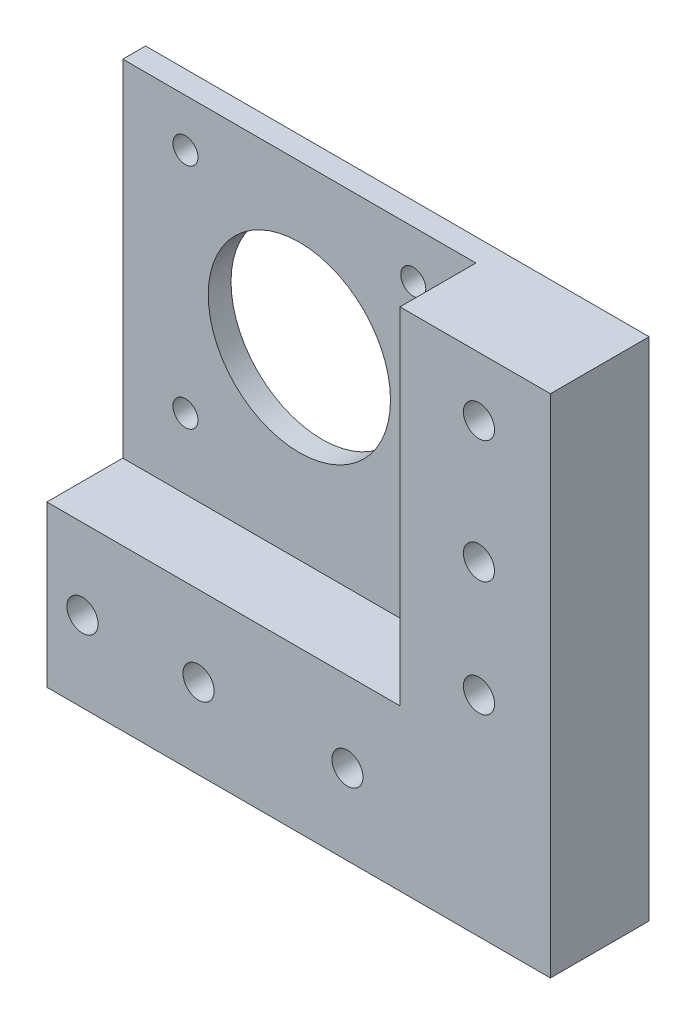
ISO-10303-21;
HEADER;
FILE_DESCRIPTION(('STEP AP214'),'2;1');
FILE_NAME('part.step','',(''),(''),'','','');
FILE_SCHEMA(('AUTOMOTIVE_DESIGN { 1 0 10303 214 1 1 1 1 }'));
ENDSEC;
DATA;
#1=APPLICATION_CONTEXT('core data for automotive mechanical design processes');
#2=APPLICATION_PROTOCOL_DEFINITION('international standard','automotive_design',2000,#1);
#3=PRODUCT_CONTEXT('',#1,'mechanical');
#4=PRODUCT('Part','Part','',(#3));
#5=PRODUCT_RELATED_PRODUCT_CATEGORY('part','',(#4));
#6=PRODUCT_DEFINITION_FORMATION('','',#4);
#7=PRODUCT_DEFINITION_CONTEXT('part definition',#1,'design');
#8=PRODUCT_DEFINITION('design','',#6,#7);
#9=PRODUCT_DEFINITION_SHAPE('','',#8);
#10=(LENGTH_UNIT() NAMED_UNIT(*) SI_UNIT(.MILLI.,.METRE.));
#11=(NAMED_UNIT(*) PLANE_ANGLE_UNIT() SI_UNIT($,.RADIAN.));
#12=(NAMED_UNIT(*) SI_UNIT($,.STERADIAN.) SOLID_ANGLE_UNIT());
#13=UNCERTAINTY_MEASURE_WITH_UNIT(LENGTH_MEASURE(1.E-05),#10,'distance_accuracy_value','');
#14=(GEOMETRIC_REPRESENTATION_CONTEXT(3) GLOBAL_UNCERTAINTY_ASSIGNED_CONTEXT((#13)) GLOBAL_UNIT_ASSIGNED_CONTEXT((#10,
#11,#12)) REPRESENTATION_CONTEXT('',''));
#15=CARTESIAN_POINT('',(0.,0.,0.));
#16=DIRECTION('',(0.,0.,1.));
#17=DIRECTION('',(1.,0.,0.));
#18=AXIS2_PLACEMENT_3D('',#15,#16,#17);
#19=CARTESIAN_POINT('',(0.,3.,0.));
#20=DIRECTION('',(-1.,0.,0.));
#21=DIRECTION('',(0.,0.,1.));
#22=AXIS2_PLACEMENT_3D('',#19,#20,#21);
#23=PLANE('',#22);
#24=DIRECTION('',(0.,0.,1.));
#25=VECTOR('',#24,1.);
#26=CARTESIAN_POINT('',(0.,45.5,0.));
#27=LINE('',#26,#25);
#28=CARTESIAN_POINT('',(0.,45.5,-3.));
#29=VERTEX_POINT('',#28);
#30=CARTESIAN_POINT('',(0.,45.5,0.));
#31=VERTEX_POINT('',#30);
#32=EDGE_CURVE('E49',#29,#31,#27,.T.);
#33=ORIENTED_EDGE('',*,*,#32,.F.);
#34=DIRECTION('',(0.,-1.,0.));
#35=VECTOR('',#34,1.);
#36=CARTESIAN_POINT('',(0.,0.,-3.));
#37=LINE('',#36,#35);
#38=CARTESIAN_POINT('',(0.,-21.1335669329671,-3.));
#39=VERTEX_POINT('',#38);
#40=EDGE_CURVE('E56',#29,#39,#37,.T.);
#41=ORIENTED_EDGE('',*,*,#40,.T.);
#42=DIRECTION('',(0.,0.,1.));
#43=VECTOR('',#42,1.);
#44=CARTESIAN_POINT('',(0.,-21.1335669329671,-3.));
#45=LINE('',#44,#43);
#46=CARTESIAN_POINT('',(0.,-21.1335669329671,10.));
#47=VERTEX_POINT('',#46);
#48=EDGE_CURVE('E118',#39,#47,#45,.T.);
#49=ORIENTED_EDGE('',*,*,#48,.T.);
#50=DIRECTION('',(0.,-1.,0.));
#51=VECTOR('',#50,1.);
#52=CARTESIAN_POINT('',(0.,0.,10.));
#53=LINE('',#52,#51);
#54=CARTESIAN_POINT('',(0.,0.,10.));
#55=VERTEX_POINT('',#54);
#56=EDGE_CURVE('E195',#55,#47,#53,.T.);
#57=ORIENTED_EDGE('',*,*,#56,.F.);
#58=DIRECTION('',(0.,0.,1.));
#59=VECTOR('',#58,1.);
#60=CARTESIAN_POINT('',(0.,0.,-3.));
#61=LINE('',#60,#59);
#62=CARTESIAN_POINT('',(0.,0.,0.));
#63=VERTEX_POINT('',#62);
#64=EDGE_CURVE('E169',#63,#55,#61,.T.);
#65=ORIENTED_EDGE('',*,*,#64,.F.);
#66=DIRECTION('',(0.,-1.,0.));
#67=VECTOR('',#66,1.);
#68=CARTESIAN_POINT('',(0.,3.,0.));
#69=LINE('',#68,#67);
#70=EDGE_CURVE('E11',#31,#63,#69,.T.);
#71=ORIENTED_EDGE('',*,*,#70,.F.);
#72=EDGE_LOOP('',(#33,#41,#49,#57,#65,#71));
#73=FACE_BOUND('',#72,.T.);
#74=ADVANCED_FACE('F35',(#73),#23,.T.);
#75=CARTESIAN_POINT('',(0.,45.5,0.));
#76=DIRECTION('',(0.,1.,0.));
#77=DIRECTION('',(0.,0.,1.));
#78=AXIS2_PLACEMENT_3D('',#75,#76,#77);
#79=PLANE('',#78);
#80=DIRECTION('',(0.,0.,1.));
#81=VECTOR('',#80,1.);
#82=CARTESIAN_POINT('',(66.3112991356769,45.5,-3.));
#83=LINE('',#82,#81);
#84=CARTESIAN_POINT('',(66.3112991356769,45.5,-3.));
#85=VERTEX_POINT('',#84);
#86=CARTESIAN_POINT('',(66.3112991356769,45.5,10.));
#87=VERTEX_POINT('',#86);
#88=EDGE_CURVE('E95',#85,#87,#83,.T.);
#89=ORIENTED_EDGE('',*,*,#88,.F.);
#90=DIRECTION('',(1.,0.,0.));
#91=VECTOR('',#90,1.);
#92=CARTESIAN_POINT('',(0.,45.5,-3.));
#93=LINE('',#92,#91);
#94=EDGE_CURVE('E92',#29,#85,#93,.T.);
#95=ORIENTED_EDGE('',*,*,#94,.F.);
#96=ORIENTED_EDGE('',*,*,#32,.T.);
#97=DIRECTION('',(1.,0.,0.));
#98=VECTOR('',#97,1.);
#99=CARTESIAN_POINT('',(0.,45.5,0.));
#100=LINE('',#99,#98);
#101=CARTESIAN_POINT('',(46.5,45.5,0.));
#102=VERTEX_POINT('',#101);
#103=EDGE_CURVE('E42',#31,#102,#100,.T.);
#104=ORIENTED_EDGE('',*,*,#103,.T.);
#105=DIRECTION('',(0.,0.,1.));
#106=VECTOR('',#105,1.);
#107=CARTESIAN_POINT('',(46.5,45.5,-3.));
#108=LINE('',#107,#106);
#109=CARTESIAN_POINT('',(46.5,45.5,10.));
#110=VERTEX_POINT('',#109);
#111=EDGE_CURVE('E172',#102,#110,#108,.T.);
#112=ORIENTED_EDGE('',*,*,#111,.T.);
#113=DIRECTION('',(1.,0.,0.));
#114=VECTOR('',#113,1.);
#115=CARTESIAN_POINT('',(0.,45.5,10.));
#116=LINE('',#115,#114);
#117=EDGE_CURVE('E204',#110,#87,#116,.T.);
#118=ORIENTED_EDGE('',*,*,#117,.T.);
#119=EDGE_LOOP('',(#89,#95,#96,#104,#112,#118));
#120=FACE_BOUND('',#119,.T.);
#121=ADVANCED_FACE('F93',(#120),#79,.T.);
#122=CARTESIAN_POINT('',(0.,3.,0.));
#123=DIRECTION('',(0.,0.,1.));
#124=DIRECTION('',(1.,0.,0.));
#125=AXIS2_PLACEMENT_3D('',#122,#123,#124);
#126=PLANE('',#125);
#127=CARTESIAN_POINT('',(8.25000000000007,9.24999999999999,0.));
#128=DIRECTION('',(0.,0.,1.));
#129=DIRECTION('',(1.,0.,0.));
#130=AXIS2_PLACEMENT_3D('',#127,#128,#129);
#131=CIRCLE('',#130,1.65);
#132=CARTESIAN_POINT('',(9.90000000000007,9.24999999999999,0.));
#133=VERTEX_POINT('',#132);
#134=EDGE_CURVE('E111',#133,#133,#131,.T.);
#135=ORIENTED_EDGE('',*,*,#134,.F.);
#136=EDGE_LOOP('',(#135));
#137=FACE_BOUND('',#136,.T.);
#138=CARTESIAN_POINT('',(8.25000000000007,39.25,0.));
#139=DIRECTION('',(0.,0.,1.));
#140=DIRECTION('',(1.,0.,0.));
#141=AXIS2_PLACEMENT_3D('',#138,#139,#140);
#142=CIRCLE('',#141,1.65);
#143=CARTESIAN_POINT('',(9.90000000000007,39.25,0.));
#144=VERTEX_POINT('',#143);
#145=EDGE_CURVE('E121',#144,#144,#142,.T.);
#146=ORIENTED_EDGE('',*,*,#145,.F.);
#147=EDGE_LOOP('',(#146));
#148=FACE_BOUND('',#147,.T.);
#149=CARTESIAN_POINT('',(38.25,39.25,0.));
#150=DIRECTION('',(0.,0.,1.));
#151=DIRECTION('',(1.,0.,0.));
#152=AXIS2_PLACEMENT_3D('',#149,#150,#151);
#153=CIRCLE('',#152,1.65);
#154=CARTESIAN_POINT('',(39.9,39.25,0.));
#155=VERTEX_POINT('',#154);
#156=EDGE_CURVE('E117',#155,#155,#153,.T.);
#157=ORIENTED_EDGE('',*,*,#156,.F.);
#158=EDGE_LOOP('',(#157));
#159=FACE_BOUND('',#158,.T.);
#160=CARTESIAN_POINT('',(38.2500000000001,9.24999999999999,0.));
#161=DIRECTION('',(0.,0.,1.));
#162=DIRECTION('',(1.,0.,0.));
#163=AXIS2_PLACEMENT_3D('',#160,#161,#162);
#164=CIRCLE('',#163,1.65);
#165=CARTESIAN_POINT('',(39.9000000000001,9.24999999999999,0.));
#166=VERTEX_POINT('',#165);
#167=EDGE_CURVE('E114',#166,#166,#164,.T.);
#168=ORIENTED_EDGE('',*,*,#167,.F.);
#169=EDGE_LOOP('',(#168));
#170=FACE_BOUND('',#169,.T.);
#171=CARTESIAN_POINT('',(23.25,24.25,0.));
#172=DIRECTION('',(0.,0.,1.));
#173=DIRECTION('',(1.,0.,0.));
#174=AXIS2_PLACEMENT_3D('',#171,#172,#173);
#175=CIRCLE('',#174,12.);
#176=CARTESIAN_POINT('',(35.25,24.25,0.));
#177=VERTEX_POINT('',#176);
#178=EDGE_CURVE('E108',#177,#177,#175,.T.);
#179=ORIENTED_EDGE('',*,*,#178,.F.);
#180=EDGE_LOOP('',(#179));
#181=FACE_BOUND('',#180,.T.);
#182=ORIENTED_EDGE('',*,*,#70,.T.);
#183=DIRECTION('',(1.,0.,0.));
#184=VECTOR('',#183,1.);
#185=CARTESIAN_POINT('',(0.,0.,0.));
#186=LINE('',#185,#184);
#187=CARTESIAN_POINT('',(46.5,0.,0.));
#188=VERTEX_POINT('',#187);
#189=EDGE_CURVE('E163',#63,#188,#186,.T.);
#190=ORIENTED_EDGE('',*,*,#189,.T.);
#191=DIRECTION('',(0.,1.,0.));
#192=VECTOR('',#191,1.);
#193=CARTESIAN_POINT('',(46.5,3.,0.));
#194=LINE('',#193,#192);
#195=EDGE_CURVE('E166',#188,#102,#194,.T.);
#196=ORIENTED_EDGE('',*,*,#195,.T.);
#197=ORIENTED_EDGE('',*,*,#103,.F.);
#198=EDGE_LOOP('',(#182,#190,#196,#197));
#199=FACE_BOUND('',#198,.T.);
#200=ADVANCED_FACE('F240',(#137,#148,#159,#170,#181,#199),#126,.T.);
#201=CARTESIAN_POINT('',(23.25,24.25,-40.));
#202=DIRECTION('',(0.,0.,1.));
#203=DIRECTION('',(1.,0.,0.));
#204=AXIS2_PLACEMENT_3D('',#201,#202,#203);
#205=CYLINDRICAL_SURFACE('',#204,12.);
#206=ORIENTED_EDGE('',*,*,#178,.T.);
#207=EDGE_LOOP('',(#206));
#208=FACE_BOUND('',#207,.T.);
#209=CARTESIAN_POINT('',(23.25,24.25,-3.));
#210=DIRECTION('',(0.,0.,1.));
#211=DIRECTION('',(1.,0.,0.));
#212=AXIS2_PLACEMENT_3D('',#209,#210,#211);
#213=CIRCLE('',#212,12.);
#214=CARTESIAN_POINT('',(35.25,24.25,-3.));
#215=VERTEX_POINT('',#214);
#216=EDGE_CURVE('E143',#215,#215,#213,.F.);
#217=ORIENTED_EDGE('',*,*,#216,.T.);
#218=EDGE_LOOP('',(#217));
#219=FACE_BOUND('',#218,.T.);
#220=ADVANCED_FACE('F245',(#208,#219),#205,.F.);
#221=CARTESIAN_POINT('',(38.2500000000001,9.24999999999999,-40.));
#222=DIRECTION('',(0.,0.,1.));
#223=DIRECTION('',(1.,0.,0.));
#224=AXIS2_PLACEMENT_3D('',#221,#222,#223);
#225=CYLINDRICAL_SURFACE('',#224,1.65);
#226=ORIENTED_EDGE('',*,*,#167,.T.);
#227=EDGE_LOOP('',(#226));
#228=FACE_BOUND('',#227,.T.);
#229=CARTESIAN_POINT('',(38.2500000000001,9.24999999999999,-3.));
#230=DIRECTION('',(0.,0.,1.));
#231=DIRECTION('',(1.,0.,0.));
#232=AXIS2_PLACEMENT_3D('',#229,#230,#231);
#233=CIRCLE('',#232,1.65);
#234=CARTESIAN_POINT('',(39.9000000000001,9.24999999999999,-3.));
#235=VERTEX_POINT('',#234);
#236=EDGE_CURVE('E146',#235,#235,#233,.F.);
#237=ORIENTED_EDGE('',*,*,#236,.T.);
#238=EDGE_LOOP('',(#237));
#239=FACE_BOUND('',#238,.T.);
#240=ADVANCED_FACE('F250',(#228,#239),#225,.F.);
#241=CARTESIAN_POINT('',(38.25,39.25,-40.));
#242=DIRECTION('',(0.,0.,1.));
#243=DIRECTION('',(1.,0.,0.));
#244=AXIS2_PLACEMENT_3D('',#241,#242,#243);
#245=CYLINDRICAL_SURFACE('',#244,1.65);
#246=ORIENTED_EDGE('',*,*,#156,.T.);
#247=EDGE_LOOP('',(#246));
#248=FACE_BOUND('',#247,.T.);
#249=CARTESIAN_POINT('',(38.25,39.25,-3.));
#250=DIRECTION('',(0.,0.,1.));
#251=DIRECTION('',(1.,0.,0.));
#252=AXIS2_PLACEMENT_3D('',#249,#250,#251);
#253=CIRCLE('',#252,1.65);
#254=CARTESIAN_POINT('',(39.9,39.25,-3.));
#255=VERTEX_POINT('',#254);
#256=EDGE_CURVE('E140',#255,#255,#253,.F.);
#257=ORIENTED_EDGE('',*,*,#256,.T.);
#258=EDGE_LOOP('',(#257));
#259=FACE_BOUND('',#258,.T.);
#260=ADVANCED_FACE('F254',(#248,#259),#245,.F.);
#261=CARTESIAN_POINT('',(8.25000000000007,39.25,-40.));
#262=DIRECTION('',(0.,0.,1.));
#263=DIRECTION('',(1.,0.,0.));
#264=AXIS2_PLACEMENT_3D('',#261,#262,#263);
#265=CYLINDRICAL_SURFACE('',#264,1.65);
#266=ORIENTED_EDGE('',*,*,#145,.T.);
#267=EDGE_LOOP('',(#266));
#268=FACE_BOUND('',#267,.T.);
#269=CARTESIAN_POINT('',(8.25000000000007,39.25,-3.));
#270=DIRECTION('',(0.,0.,1.));
#271=DIRECTION('',(1.,0.,0.));
#272=AXIS2_PLACEMENT_3D('',#269,#270,#271);
#273=CIRCLE('',#272,1.65);
#274=CARTESIAN_POINT('',(9.90000000000007,39.25,-3.));
#275=VERTEX_POINT('',#274);
#276=EDGE_CURVE('E149',#275,#275,#273,.F.);
#277=ORIENTED_EDGE('',*,*,#276,.T.);
#278=EDGE_LOOP('',(#277));
#279=FACE_BOUND('',#278,.T.);
#280=ADVANCED_FACE('F258',(#268,#279),#265,.F.);
#281=CARTESIAN_POINT('',(8.25000000000007,9.24999999999999,-40.));
#282=DIRECTION('',(0.,0.,1.));
#283=DIRECTION('',(1.,0.,0.));
#284=AXIS2_PLACEMENT_3D('',#281,#282,#283);
#285=CYLINDRICAL_SURFACE('',#284,1.65);
#286=ORIENTED_EDGE('',*,*,#134,.T.);
#287=EDGE_LOOP('',(#286));
#288=FACE_BOUND('',#287,.T.);
#289=CARTESIAN_POINT('',(8.25000000000007,9.24999999999999,-3.));
#290=DIRECTION('',(0.,0.,1.));
#291=DIRECTION('',(1.,0.,0.));
#292=AXIS2_PLACEMENT_3D('',#289,#290,#291);
#293=CIRCLE('',#292,1.65);
#294=CARTESIAN_POINT('',(9.90000000000007,9.24999999999999,-3.));
#295=VERTEX_POINT('',#294);
#296=EDGE_CURVE('E137',#295,#295,#293,.F.);
#297=ORIENTED_EDGE('',*,*,#296,.T.);
#298=EDGE_LOOP('',(#297));
#299=FACE_BOUND('',#298,.T.);
#300=ADVANCED_FACE('F232',(#288,#299),#285,.F.);
#301=CARTESIAN_POINT('',(0.,0.,-3.));
#302=DIRECTION('',(0.,0.,1.));
#303=DIRECTION('',(1.,0.,0.));
#304=AXIS2_PLACEMENT_3D('',#301,#302,#303);
#305=PLANE('',#304);
#306=CARTESIAN_POINT('',(39.5824358543138,-10.5667834664835,-3.));
#307=DIRECTION('',(0.,0.,1.));
#308=DIRECTION('',(1.,0.,0.));
#309=AXIS2_PLACEMENT_3D('',#306,#307,#308);
#310=CIRCLE('',#309,2.04999999999999);
#311=CARTESIAN_POINT('',(41.6324358543138,-10.5667834664835,-3.));
#312=VERTEX_POINT('',#311);
#313=EDGE_CURVE('E127',#312,#312,#310,.T.);
#314=ORIENTED_EDGE('',*,*,#313,.T.);
#315=EDGE_LOOP('',(#314));
#316=FACE_BOUND('',#315,.T.);
#317=CARTESIAN_POINT('',(4.69126171678624,-10.5667834664835,-3.));
#318=DIRECTION('',(0.,0.,1.));
#319=DIRECTION('',(1.,0.,0.));
#320=AXIS2_PLACEMENT_3D('',#317,#318,#319);
#321=CIRCLE('',#320,2.05);
#322=CARTESIAN_POINT('',(6.74126171678624,-10.5667834664835,-3.));
#323=VERTEX_POINT('',#322);
#324=EDGE_CURVE('E131',#323,#323,#321,.T.);
#325=ORIENTED_EDGE('',*,*,#324,.T.);
#326=EDGE_LOOP('',(#325));
#327=FACE_BOUND('',#326,.T.);
#328=CARTESIAN_POINT('',(19.9769249937987,-10.5667834664835,-3.));
#329=DIRECTION('',(0.,0.,1.));
#330=DIRECTION('',(1.,0.,0.));
#331=AXIS2_PLACEMENT_3D('',#328,#329,#330);
#332=CIRCLE('',#331,2.05);
#333=CARTESIAN_POINT('',(22.0269249937987,-10.5667834664835,-3.));
#334=VERTEX_POINT('',#333);
#335=EDGE_CURVE('E134',#334,#334,#332,.T.);
#336=ORIENTED_EDGE('',*,*,#335,.T.);
#337=EDGE_LOOP('',(#336));
#338=FACE_BOUND('',#337,.T.);
#339=ORIENTED_EDGE('',*,*,#40,.F.);
#340=ORIENTED_EDGE('',*,*,#94,.T.);
#341=DIRECTION('',(0.,-1.,0.));
#342=VECTOR('',#341,1.);
#343=CARTESIAN_POINT('',(66.3112991356769,0.,-3.));
#344=LINE('',#343,#342);
#345=CARTESIAN_POINT('',(66.3112991356769,-21.1335669329671,-3.));
#346=VERTEX_POINT('',#345);
#347=EDGE_CURVE('E99',#85,#346,#344,.T.);
#348=ORIENTED_EDGE('',*,*,#347,.T.);
#349=DIRECTION('',(-1.,0.,0.));
#350=VECTOR('',#349,1.);
#351=CARTESIAN_POINT('',(0.,-21.1335669329671,-3.));
#352=LINE('',#351,#350);
#353=EDGE_CURVE('E103',#346,#39,#352,.T.);
#354=ORIENTED_EDGE('',*,*,#353,.T.);
#355=EDGE_LOOP('',(#339,#340,#348,#354));
#356=FACE_BOUND('',#355,.T.);
#357=CARTESIAN_POINT('',(56.9030733555991,21.6094458305065,-3.));
#358=DIRECTION('',(0.,0.,1.));
#359=DIRECTION('',(1.,0.,0.));
#360=AXIS2_PLACEMENT_3D('',#357,#358,#359);
#361=CIRCLE('',#360,2.04999999999999);
#362=CARTESIAN_POINT('',(58.9530733555991,21.6094458305065,-3.));
#363=VERTEX_POINT('',#362);
#364=EDGE_CURVE('E160',#363,#363,#361,.T.);
#365=ORIENTED_EDGE('',*,*,#364,.T.);
#366=EDGE_LOOP('',(#365));
#367=FACE_BOUND('',#366,.T.);
#368=CARTESIAN_POINT('',(56.9030733555991,6.42969754154166,-3.));
#369=DIRECTION('',(0.,0.,1.));
#370=DIRECTION('',(1.,0.,0.));
#371=AXIS2_PLACEMENT_3D('',#368,#369,#370);
#372=CIRCLE('',#371,2.04999999999999);
#373=CARTESIAN_POINT('',(58.9530733555991,6.42969754154166,-3.));
#374=VERTEX_POINT('',#373);
#375=EDGE_CURVE('E157',#374,#374,#372,.T.);
#376=ORIENTED_EDGE('',*,*,#375,.T.);
#377=EDGE_LOOP('',(#376));
#378=FACE_BOUND('',#377,.T.);
#379=CARTESIAN_POINT('',(56.9030733555991,37.7215889065994,-3.));
#380=DIRECTION('',(0.,0.,1.));
#381=DIRECTION('',(1.,0.,0.));
#382=AXIS2_PLACEMENT_3D('',#379,#380,#381);
#383=CIRCLE('',#382,2.04999999999999);
#384=CARTESIAN_POINT('',(58.9530733555991,37.7215889065994,-3.));
#385=VERTEX_POINT('',#384);
#386=EDGE_CURVE('E154',#385,#385,#383,.T.);
#387=ORIENTED_EDGE('',*,*,#386,.T.);
#388=EDGE_LOOP('',(#387));
#389=FACE_BOUND('',#388,.T.);
#390=ORIENTED_EDGE('',*,*,#296,.F.);
#391=EDGE_LOOP('',(#390));
#392=FACE_BOUND('',#391,.T.);
#393=ORIENTED_EDGE('',*,*,#256,.F.);
#394=EDGE_LOOP('',(#393));
#395=FACE_BOUND('',#394,.T.);
#396=ORIENTED_EDGE('',*,*,#216,.F.);
#397=EDGE_LOOP('',(#396));
#398=FACE_BOUND('',#397,.T.);
#399=ORIENTED_EDGE('',*,*,#236,.F.);
#400=EDGE_LOOP('',(#399));
#401=FACE_BOUND('',#400,.T.);
#402=ORIENTED_EDGE('',*,*,#276,.F.);
#403=EDGE_LOOP('',(#402));
#404=FACE_BOUND('',#403,.T.);
#405=ADVANCED_FACE('F101',(#316,#327,#338,#356,#367,#378,#389,#392,#395,#398,#401,#404),#305,.F.);
#406=CARTESIAN_POINT('',(66.3112991356769,0.,-3.));
#407=DIRECTION('',(-1.,0.,0.));
#408=DIRECTION('',(0.,0.,1.));
#409=AXIS2_PLACEMENT_3D('',#406,#407,#408);
#410=PLANE('',#409);
#411=ORIENTED_EDGE('',*,*,#88,.T.);
#412=DIRECTION('',(0.,1.,0.));
#413=VECTOR('',#412,1.);
#414=CARTESIAN_POINT('',(66.3112991356769,0.,10.));
#415=LINE('',#414,#413);
#416=CARTESIAN_POINT('',(66.3112991356769,-21.1335669329671,10.));
#417=VERTEX_POINT('',#416);
#418=EDGE_CURVE('E206',#417,#87,#415,.T.);
#419=ORIENTED_EDGE('',*,*,#418,.F.);
#420=DIRECTION('',(0.,0.,1.));
#421=VECTOR('',#420,1.);
#422=CARTESIAN_POINT('',(66.3112991356769,-21.1335669329671,-3.));
#423=LINE('',#422,#421);
#424=EDGE_CURVE('E170',#346,#417,#423,.T.);
#425=ORIENTED_EDGE('',*,*,#424,.F.);
#426=ORIENTED_EDGE('',*,*,#347,.F.);
#427=EDGE_LOOP('',(#411,#419,#425,#426));
#428=FACE_BOUND('',#427,.T.);
#429=ADVANCED_FACE('F223',(#428),#410,.F.);
#430=CARTESIAN_POINT('',(0.,-21.1335669329671,-3.));
#431=DIRECTION('',(0.,1.,0.));
#432=DIRECTION('',(0.,0.,1.));
#433=AXIS2_PLACEMENT_3D('',#430,#431,#432);
#434=PLANE('',#433);
#435=DIRECTION('',(1.,0.,0.));
#436=VECTOR('',#435,1.);
#437=CARTESIAN_POINT('',(0.,-21.1335669329671,10.));
#438=LINE('',#437,#436);
#439=EDGE_CURVE('E209',#47,#417,#438,.T.);
#440=ORIENTED_EDGE('',*,*,#439,.F.);
#441=ORIENTED_EDGE('',*,*,#48,.F.);
#442=ORIENTED_EDGE('',*,*,#353,.F.);
#443=ORIENTED_EDGE('',*,*,#424,.T.);
#444=EDGE_LOOP('',(#440,#441,#442,#443));
#445=FACE_BOUND('',#444,.T.);
#446=ADVANCED_FACE('F220',(#445),#434,.F.);
#447=CARTESIAN_POINT('',(4.69126171678624,-10.5667834664835,-3.));
#448=DIRECTION('',(0.,0.,1.));
#449=DIRECTION('',(1.,0.,0.));
#450=AXIS2_PLACEMENT_3D('',#447,#448,#449);
#451=CYLINDRICAL_SURFACE('',#450,2.05);
#452=ORIENTED_EDGE('',*,*,#324,.F.);
#453=EDGE_LOOP('',(#452));
#454=FACE_BOUND('',#453,.T.);
#455=CARTESIAN_POINT('',(4.69126171678624,-10.5667834664835,10.));
#456=DIRECTION('',(0.,0.,1.));
#457=DIRECTION('',(1.,0.,0.));
#458=AXIS2_PLACEMENT_3D('',#455,#456,#457);
#459=CIRCLE('',#458,2.05);
#460=CARTESIAN_POINT('',(6.74126171678624,-10.5667834664835,10.));
#461=VERTEX_POINT('',#460);
#462=EDGE_CURVE('E189',#461,#461,#459,.T.);
#463=ORIENTED_EDGE('',*,*,#462,.T.);
#464=EDGE_LOOP('',(#463));
#465=FACE_BOUND('',#464,.T.);
#466=ADVANCED_FACE('F230',(#454,#465),#451,.F.);
#467=CARTESIAN_POINT('',(19.9769249937987,-10.5667834664835,-3.));
#468=DIRECTION('',(0.,0.,1.));
#469=DIRECTION('',(1.,0.,0.));
#470=AXIS2_PLACEMENT_3D('',#467,#468,#469);
#471=CYLINDRICAL_SURFACE('',#470,2.05);
#472=ORIENTED_EDGE('',*,*,#335,.F.);
#473=EDGE_LOOP('',(#472));
#474=FACE_BOUND('',#473,.T.);
#475=CARTESIAN_POINT('',(19.9769249937987,-10.5667834664835,10.));
#476=DIRECTION('',(0.,0.,1.));
#477=DIRECTION('',(1.,0.,0.));
#478=AXIS2_PLACEMENT_3D('',#475,#476,#477);
#479=CIRCLE('',#478,2.05);
#480=CARTESIAN_POINT('',(22.0269249937987,-10.5667834664835,10.));
#481=VERTEX_POINT('',#480);
#482=EDGE_CURVE('E192',#481,#481,#479,.T.);
#483=ORIENTED_EDGE('',*,*,#482,.T.);
#484=EDGE_LOOP('',(#483));
#485=FACE_BOUND('',#484,.T.);
#486=ADVANCED_FACE('F276',(#474,#485),#471,.F.);
#487=CARTESIAN_POINT('',(56.9030733555991,37.7215889065994,-3.));
#488=DIRECTION('',(0.,0.,1.));
#489=DIRECTION('',(1.,0.,0.));
#490=AXIS2_PLACEMENT_3D('',#487,#488,#489);
#491=CYLINDRICAL_SURFACE('',#490,2.04999999999999);
#492=ORIENTED_EDGE('',*,*,#386,.F.);
#493=EDGE_LOOP('',(#492));
#494=FACE_BOUND('',#493,.T.);
#495=CARTESIAN_POINT('',(56.9030733555991,37.7215889065994,10.));
#496=DIRECTION('',(0.,0.,1.));
#497=DIRECTION('',(1.,0.,0.));
#498=AXIS2_PLACEMENT_3D('',#495,#496,#497);
#499=CIRCLE('',#498,2.04999999999999);
#500=CARTESIAN_POINT('',(58.9530733555991,37.7215889065994,10.));
#501=VERTEX_POINT('',#500);
#502=EDGE_CURVE('E173',#501,#501,#499,.T.);
#503=ORIENTED_EDGE('',*,*,#502,.T.);
#504=EDGE_LOOP('',(#503));
#505=FACE_BOUND('',#504,.T.);
#506=ADVANCED_FACE('F273',(#494,#505),#491,.F.);
#507=CARTESIAN_POINT('',(56.9030733555991,6.42969754154166,-3.));
#508=DIRECTION('',(0.,0.,1.));
#509=DIRECTION('',(1.,0.,0.));
#510=AXIS2_PLACEMENT_3D('',#507,#508,#509);
#511=CYLINDRICAL_SURFACE('',#510,2.04999999999999);
#512=ORIENTED_EDGE('',*,*,#375,.F.);
#513=EDGE_LOOP('',(#512));
#514=FACE_BOUND('',#513,.T.);
#515=CARTESIAN_POINT('',(56.9030733555991,6.42969754154166,10.));
#516=DIRECTION('',(0.,0.,1.));
#517=DIRECTION('',(1.,0.,0.));
#518=AXIS2_PLACEMENT_3D('',#515,#516,#517);
#519=CIRCLE('',#518,2.04999999999999);
#520=CARTESIAN_POINT('',(58.9530733555991,6.42969754154166,10.));
#521=VERTEX_POINT('',#520);
#522=EDGE_CURVE('E180',#521,#521,#519,.T.);
#523=ORIENTED_EDGE('',*,*,#522,.T.);
#524=EDGE_LOOP('',(#523));
#525=FACE_BOUND('',#524,.T.);
#526=ADVANCED_FACE('F270',(#514,#525),#511,.F.);
#527=CARTESIAN_POINT('',(56.9030733555991,21.6094458305065,-3.));
#528=DIRECTION('',(0.,0.,1.));
#529=DIRECTION('',(1.,0.,0.));
#530=AXIS2_PLACEMENT_3D('',#527,#528,#529);
#531=CYLINDRICAL_SURFACE('',#530,2.04999999999999);
#532=ORIENTED_EDGE('',*,*,#364,.F.);
#533=EDGE_LOOP('',(#532));
#534=FACE_BOUND('',#533,.T.);
#535=CARTESIAN_POINT('',(56.9030733555991,21.6094458305065,10.));
#536=DIRECTION('',(0.,0.,1.));
#537=DIRECTION('',(1.,0.,0.));
#538=AXIS2_PLACEMENT_3D('',#535,#536,#537);
#539=CIRCLE('',#538,2.04999999999999);
#540=CARTESIAN_POINT('',(58.9530733555991,21.6094458305065,10.));
#541=VERTEX_POINT('',#540);
#542=EDGE_CURVE('E183',#541,#541,#539,.T.);
#543=ORIENTED_EDGE('',*,*,#542,.T.);
#544=EDGE_LOOP('',(#543));
#545=FACE_BOUND('',#544,.T.);
#546=ADVANCED_FACE('F266',(#534,#545),#531,.F.);
#547=CARTESIAN_POINT('',(39.5824358543138,-10.5667834664835,-3.));
#548=DIRECTION('',(0.,0.,1.));
#549=DIRECTION('',(1.,0.,0.));
#550=AXIS2_PLACEMENT_3D('',#547,#548,#549);
#551=CYLINDRICAL_SURFACE('',#550,2.04999999999999);
#552=ORIENTED_EDGE('',*,*,#313,.F.);
#553=EDGE_LOOP('',(#552));
#554=FACE_BOUND('',#553,.T.);
#555=CARTESIAN_POINT('',(39.5824358543138,-10.5667834664835,10.));
#556=DIRECTION('',(0.,0.,1.));
#557=DIRECTION('',(1.,0.,0.));
#558=AXIS2_PLACEMENT_3D('',#555,#556,#557);
#559=CIRCLE('',#558,2.04999999999999);
#560=CARTESIAN_POINT('',(41.6324358543138,-10.5667834664835,10.));
#561=VERTEX_POINT('',#560);
#562=EDGE_CURVE('E186',#561,#561,#559,.T.);
#563=ORIENTED_EDGE('',*,*,#562,.T.);
#564=EDGE_LOOP('',(#563));
#565=FACE_BOUND('',#564,.T.);
#566=ADVANCED_FACE('F269',(#554,#565),#551,.F.);
#567=CARTESIAN_POINT('',(0.,0.,-3.));
#568=DIRECTION('',(0.,-1.,0.));
#569=DIRECTION('',(0.,0.,-1.));
#570=AXIS2_PLACEMENT_3D('',#567,#568,#569);
#571=PLANE('',#570);
#572=ORIENTED_EDGE('',*,*,#189,.F.);
#573=ORIENTED_EDGE('',*,*,#64,.T.);
#574=DIRECTION('',(1.,0.,0.));
#575=VECTOR('',#574,1.);
#576=CARTESIAN_POINT('',(0.,0.,10.));
#577=LINE('',#576,#575);
#578=CARTESIAN_POINT('',(46.5,0.,10.));
#579=VERTEX_POINT('',#578);
#580=EDGE_CURVE('E198',#55,#579,#577,.T.);
#581=ORIENTED_EDGE('',*,*,#580,.T.);
#582=DIRECTION('',(0.,0.,1.));
#583=VECTOR('',#582,1.);
#584=CARTESIAN_POINT('',(46.5,0.,-3.));
#585=LINE('',#584,#583);
#586=EDGE_CURVE('E175',#188,#579,#585,.T.);
#587=ORIENTED_EDGE('',*,*,#586,.F.);
#588=EDGE_LOOP('',(#572,#573,#581,#587));
#589=FACE_BOUND('',#588,.T.);
#590=ADVANCED_FACE('F293',(#589),#571,.F.);
#591=CARTESIAN_POINT('',(46.5,0.,-3.));
#592=DIRECTION('',(1.,0.,0.));
#593=DIRECTION('',(0.,0.,-1.));
#594=AXIS2_PLACEMENT_3D('',#591,#592,#593);
#595=PLANE('',#594);
#596=ORIENTED_EDGE('',*,*,#195,.F.);
#597=ORIENTED_EDGE('',*,*,#586,.T.);
#598=DIRECTION('',(0.,1.,0.));
#599=VECTOR('',#598,1.);
#600=CARTESIAN_POINT('',(46.5,0.,10.));
#601=LINE('',#600,#599);
#602=EDGE_CURVE('E201',#579,#110,#601,.T.);
#603=ORIENTED_EDGE('',*,*,#602,.T.);
#604=ORIENTED_EDGE('',*,*,#111,.F.);
#605=EDGE_LOOP('',(#596,#597,#603,#604));
#606=FACE_BOUND('',#605,.T.);
#607=ADVANCED_FACE('F288',(#606),#595,.F.);
#608=CARTESIAN_POINT('',(0.,0.,10.));
#609=DIRECTION('',(0.,0.,1.));
#610=DIRECTION('',(1.,0.,0.));
#611=AXIS2_PLACEMENT_3D('',#608,#609,#610);
#612=PLANE('',#611);
#613=ORIENTED_EDGE('',*,*,#439,.T.);
#614=ORIENTED_EDGE('',*,*,#418,.T.);
#615=ORIENTED_EDGE('',*,*,#117,.F.);
#616=ORIENTED_EDGE('',*,*,#602,.F.);
#617=ORIENTED_EDGE('',*,*,#580,.F.);
#618=ORIENTED_EDGE('',*,*,#56,.T.);
#619=EDGE_LOOP('',(#613,#614,#615,#616,#617,#618));
#620=FACE_BOUND('',#619,.T.);
#621=ORIENTED_EDGE('',*,*,#482,.F.);
#622=EDGE_LOOP('',(#621));
#623=FACE_BOUND('',#622,.T.);
#624=ORIENTED_EDGE('',*,*,#462,.F.);
#625=EDGE_LOOP('',(#624));
#626=FACE_BOUND('',#625,.T.);
#627=ORIENTED_EDGE('',*,*,#562,.F.);
#628=EDGE_LOOP('',(#627));
#629=FACE_BOUND('',#628,.T.);
#630=ORIENTED_EDGE('',*,*,#542,.F.);
#631=EDGE_LOOP('',(#630));
#632=FACE_BOUND('',#631,.T.);
#633=ORIENTED_EDGE('',*,*,#522,.F.);
#634=EDGE_LOOP('',(#633));
#635=FACE_BOUND('',#634,.T.);
#636=ORIENTED_EDGE('',*,*,#502,.F.);
#637=EDGE_LOOP('',(#636));
#638=FACE_BOUND('',#637,.T.);
#639=ADVANCED_FACE('F213',(#620,#623,#626,#629,#632,#635,#638),#612,.T.);
#640=CLOSED_SHELL('',(#74,#121,#200,#220,#240,#260,#280,#300,#405,#429,#446,#466,#486,#506,#526,
#546,#566,#590,#607,#639));
#641=MANIFOLD_SOLID_BREP('B2',#640);
#642=ADVANCED_BREP_SHAPE_REPRESENTATION('',(#18,#641),#14);
#643=SHAPE_DEFINITION_REPRESENTATION(#9,#642);
ENDSEC;
END-ISO-10303-21;
